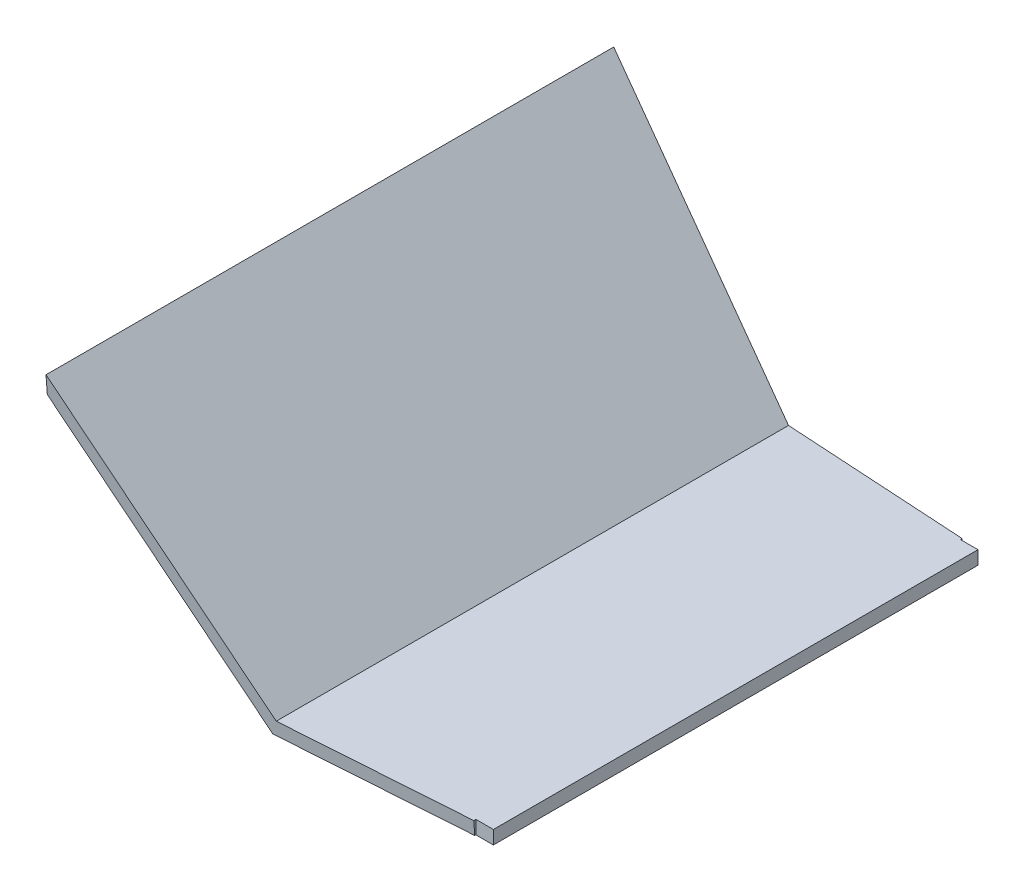
ISO-10303-21;
HEADER;
FILE_DESCRIPTION(('STEP AP214'),'2;1');
FILE_NAME('part.step','',(''),(''),'','','');
FILE_SCHEMA(('AUTOMOTIVE_DESIGN { 1 0 10303 214 1 1 1 1 }'));
ENDSEC;
DATA;
#1=APPLICATION_CONTEXT('core data for automotive mechanical design processes');
#2=APPLICATION_PROTOCOL_DEFINITION('international standard','automotive_design',2000,#1);
#3=PRODUCT_CONTEXT('',#1,'mechanical');
#4=PRODUCT('Part','Part','',(#3));
#5=PRODUCT_RELATED_PRODUCT_CATEGORY('part','',(#4));
#6=PRODUCT_DEFINITION_FORMATION('','',#4);
#7=PRODUCT_DEFINITION_CONTEXT('part definition',#1,'design');
#8=PRODUCT_DEFINITION('design','',#6,#7);
#9=PRODUCT_DEFINITION_SHAPE('','',#8);
#10=(LENGTH_UNIT() NAMED_UNIT(*) SI_UNIT(.MILLI.,.METRE.));
#11=(NAMED_UNIT(*) PLANE_ANGLE_UNIT() SI_UNIT($,.RADIAN.));
#12=(NAMED_UNIT(*) SI_UNIT($,.STERADIAN.) SOLID_ANGLE_UNIT());
#13=UNCERTAINTY_MEASURE_WITH_UNIT(LENGTH_MEASURE(1.E-05),#10,'distance_accuracy_value','');
#14=(GEOMETRIC_REPRESENTATION_CONTEXT(3) GLOBAL_UNCERTAINTY_ASSIGNED_CONTEXT((#13)) GLOBAL_UNIT_ASSIGNED_CONTEXT((#10,
#11,#12)) REPRESENTATION_CONTEXT('',''));
#15=CARTESIAN_POINT('',(0.,0.,0.));
#16=DIRECTION('',(0.,0.,1.));
#17=DIRECTION('',(1.,0.,0.));
#18=AXIS2_PLACEMENT_3D('',#15,#16,#17);
#19=CARTESIAN_POINT('',(10.0673449542567,325.798041942089,5.08));
#20=DIRECTION('',(0.0685256068119308,-0.0732675231063851,0.994955331293276));
#21=DIRECTION('',(0.,-0.997299625833669,-0.0734401546296346));
#22=AXIS2_PLACEMENT_3D('',#19,#20,#21);
#23=PLANE('',#22);
#24=DIRECTION('',(-0.99763665616323,0.,0.0687102778298093));
#25=VECTOR('',#24,1.);
#26=CARTESIAN_POINT('',(25.7885299098299,155.702260243805,-8.52845047903955));
#27=LINE('',#26,#25);
#28=CARTESIAN_POINT('',(10.3273263315878,155.702260243805,-7.46359025474718));
#29=VERTEX_POINT('',#28);
#30=CARTESIAN_POINT('',(-44.3489790529692,155.702260243805,-3.69786642085299));
#31=VERTEX_POINT('',#30);
#32=EDGE_CURVE('E164',#29,#31,#27,.T.);
#33=ORIENTED_EDGE('',*,*,#32,.F.);
#34=DIRECTION('',(0.,0.997299625833669,0.0734401546296346));
#35=VECTOR('',#34,1.);
#36=CARTESIAN_POINT('',(10.3273263315878,325.799353389214,5.06219086364831));
#37=LINE('',#36,#35);
#38=CARTESIAN_POINT('',(10.3273263315878,159.601331401217,-7.17646652453124));
#39=VERTEX_POINT('',#38);
#40=EDGE_CURVE('E53',#29,#39,#37,.T.);
#41=ORIENTED_EDGE('',*,*,#40,.T.);
#42=DIRECTION('',(0.99763665616323,0.,-0.0687102778298093));
#43=VECTOR('',#42,1.);
#44=CARTESIAN_POINT('',(-32.4831494281154,159.601331401217,-4.22797855017373));
#45=LINE('',#44,#43);
#46=CARTESIAN_POINT('',(-43.1605396181928,159.601331401217,-3.4925941374969));
#47=VERTEX_POINT('',#46);
#48=EDGE_CURVE('E148',#47,#39,#45,.T.);
#49=ORIENTED_EDGE('',*,*,#48,.F.);
#50=DIRECTION('',(0.679631594857946,-0.726661548824318,-0.100318935057585));
#51=VECTOR('',#50,1.);
#52=CARTESIAN_POINT('',(-90.0328191655817,209.717134595963,3.42612065371042));
#53=LINE('',#52,#51);
#54=CARTESIAN_POINT('',(-101.23737050154,221.697031777422,5.07999999999999));
#55=VERTEX_POINT('',#54);
#56=EDGE_CURVE('E153',#55,#47,#53,.T.);
#57=ORIENTED_EDGE('',*,*,#56,.F.);
#58=DIRECTION('',(0.,0.997299625833669,0.0734401546296346));
#59=VECTOR('',#58,1.);
#60=CARTESIAN_POINT('',(-101.23737050154,1.19571325539705,-11.1574982490935));
#61=LINE('',#60,#59);
#62=CARTESIAN_POINT('',(-101.23737050154,216.543480298302,4.70049758396129));
#63=VERTEX_POINT('',#62);
#64=EDGE_CURVE('E186',#63,#55,#61,.T.);
#65=ORIENTED_EDGE('',*,*,#64,.F.);
#66=DIRECTION('',(-0.679535061131302,0.726751822934066,0.100318934181391));
#67=VECTOR('',#66,1.);
#68=CARTESIAN_POINT('',(-33.7444084902328,144.360842517586,-5.26340626883956));
#69=LINE('',#68,#67);
#70=EDGE_CURVE('E189',#31,#63,#69,.T.);
#71=ORIENTED_EDGE('',*,*,#70,.F.);
#72=EDGE_LOOP('',(#33,#41,#49,#57,#65,#71));
#73=FACE_BOUND('',#72,.T.);
#74=ADVANCED_FACE('F45',(#73),#23,.T.);
#75=CARTESIAN_POINT('',(-101.23737050154,0.,5.08));
#76=DIRECTION('',(-1.,0.,0.));
#77=DIRECTION('',(0.,-1.,0.));
#78=AXIS2_PLACEMENT_3D('',#75,#76,#77);
#79=PLANE('',#78);
#80=DIRECTION('',(0.,0.,1.));
#81=VECTOR('',#80,1.);
#82=CARTESIAN_POINT('',(-101.23737050154,216.543480298302,-159.258));
#83=LINE('',#82,#81);
#84=CARTESIAN_POINT('',(-101.23737050154,216.543480298302,-158.926777016426));
#85=VERTEX_POINT('',#84);
#86=EDGE_CURVE('E161',#85,#63,#83,.T.);
#87=ORIENTED_EDGE('',*,*,#86,.T.);
#88=ORIENTED_EDGE('',*,*,#64,.T.);
#89=DIRECTION('',(0.,0.,1.));
#90=VECTOR('',#89,1.);
#91=CARTESIAN_POINT('',(-101.23737050154,221.697031777422,-159.258));
#92=LINE('',#91,#90);
#93=CARTESIAN_POINT('',(-101.23737050154,221.697031777422,-159.258));
#94=VERTEX_POINT('',#93);
#95=EDGE_CURVE('E179',#94,#55,#92,.T.);
#96=ORIENTED_EDGE('',*,*,#95,.F.);
#97=DIRECTION('',(0.,-0.997941007475508,0.0641384876557668));
#98=VECTOR('',#97,1.);
#99=CARTESIAN_POINT('',(-101.23737050154,-9.60668300980865,-144.391920397616));
#100=LINE('',#99,#98);
#101=EDGE_CURVE('E195',#94,#85,#100,.T.);
#102=ORIENTED_EDGE('',*,*,#101,.T.);
#103=EDGE_LOOP('',(#87,#88,#96,#102));
#104=FACE_BOUND('',#103,.T.);
#105=ADVANCED_FACE('F47',(#104),#79,.T.);
#106=CARTESIAN_POINT('',(-44.3489790529692,155.702260243805,-159.258));
#107=DIRECTION('',(-0.730436633697796,-0.682980471281743,0.));
#108=DIRECTION('',(0.682980471281743,-0.730436633697796,0.));
#109=AXIS2_PLACEMENT_3D('',#106,#107,#108);
#110=PLANE('',#109);
#111=DIRECTION('',(0.,0.,1.));
#112=VECTOR('',#111,1.);
#113=CARTESIAN_POINT('',(-44.3489790529692,155.702260243805,-159.258));
#114=LINE('',#113,#112);
#115=CARTESIAN_POINT('',(-44.3489790529692,155.702260243805,-151.596833740039));
#116=VERTEX_POINT('',#115);
#117=EDGE_CURVE('E157',#116,#31,#114,.T.);
#118=ORIENTED_EDGE('',*,*,#117,.T.);
#119=ORIENTED_EDGE('',*,*,#70,.T.);
#120=ORIENTED_EDGE('',*,*,#86,.F.);
#121=DIRECTION('',(0.680351200722359,-0.727624671105553,0.0876617457856003));
#122=VECTOR('',#121,1.);
#123=CARTESIAN_POINT('',(-44.8058969384762,156.190926576445,-151.655706597884));
#124=LINE('',#123,#122);
#125=EDGE_CURVE('E198',#85,#116,#124,.T.);
#126=ORIENTED_EDGE('',*,*,#125,.T.);
#127=EDGE_LOOP('',(#118,#119,#120,#126));
#128=FACE_BOUND('',#127,.T.);
#129=ADVANCED_FACE('F217',(#128),#110,.T.);
#130=CARTESIAN_POINT('',(-101.23737050154,221.697031777422,-159.258));
#131=DIRECTION('',(0.730345901940924,0.683077494518813,0.));
#132=DIRECTION('',(-0.683077494518813,0.730345901940924,0.));
#133=AXIS2_PLACEMENT_3D('',#130,#131,#132);
#134=PLANE('',#133);
#135=ORIENTED_EDGE('',*,*,#95,.T.);
#136=ORIENTED_EDGE('',*,*,#56,.T.);
#137=DIRECTION('',(0.,0.,1.));
#138=VECTOR('',#137,1.);
#139=CARTESIAN_POINT('',(-43.1605396181928,159.601331401217,-159.258));
#140=LINE('',#139,#138);
#141=CARTESIAN_POINT('',(-43.1605396181928,159.601331401217,-151.775991751332));
#142=VERTEX_POINT('',#141);
#143=EDGE_CURVE('E150',#142,#47,#140,.T.);
#144=ORIENTED_EDGE('',*,*,#143,.F.);
#145=DIRECTION('',(-0.680447850402848,0.727534288589483,-0.0876617465530859));
#146=VECTOR('',#145,1.);
#147=CARTESIAN_POINT('',(-101.23737050154,221.697031777422,-159.258));
#148=LINE('',#147,#146);
#149=EDGE_CURVE('E193',#142,#94,#148,.T.);
#150=ORIENTED_EDGE('',*,*,#149,.T.);
#151=EDGE_LOOP('',(#135,#136,#144,#150));
#152=FACE_BOUND('',#151,.T.);
#153=ADVANCED_FACE('F222',(#152),#134,.T.);
#154=CARTESIAN_POINT('',(-43.1605396181928,159.601331401217,-159.258));
#155=DIRECTION('',(0.,1.,0.));
#156=DIRECTION('',(0.,0.,1.));
#157=AXIS2_PLACEMENT_3D('',#154,#155,#156);
#158=PLANE('',#157);
#159=DIRECTION('',(-1.,0.,0.));
#160=VECTOR('',#159,1.);
#161=CARTESIAN_POINT('',(-43.1605396181928,159.601331401217,-7.77894523363187));
#162=LINE('',#161,#160);
#163=CARTESIAN_POINT('',(15.4073263315878,159.601331401217,-7.77894523363187));
#164=VERTEX_POINT('',#163);
#165=CARTESIAN_POINT('',(10.3273263315878,159.601331401217,-7.77894523363187));
#166=VERTEX_POINT('',#165);
#167=EDGE_CURVE('E132',#164,#166,#162,.T.);
#168=ORIENTED_EDGE('',*,*,#167,.F.);
#169=DIRECTION('',(0.,0.,1.));
#170=VECTOR('',#169,1.);
#171=CARTESIAN_POINT('',(15.4073263315878,159.601331401217,-159.258));
#172=LINE('',#171,#170);
#173=CARTESIAN_POINT('',(15.4073263315878,159.601331401217,-148.057515550619));
#174=VERTEX_POINT('',#173);
#175=EDGE_CURVE('E142',#174,#164,#172,.T.);
#176=ORIENTED_EDGE('',*,*,#175,.F.);
#177=DIRECTION('',(1.,0.,0.));
#178=VECTOR('',#177,1.);
#179=CARTESIAN_POINT('',(-43.1605396181928,159.601331401217,-148.057515550619));
#180=LINE('',#179,#178);
#181=CARTESIAN_POINT('',(10.3273263315878,159.601331401217,-148.057515550619));
#182=VERTEX_POINT('',#181);
#183=EDGE_CURVE('E133',#182,#174,#180,.T.);
#184=ORIENTED_EDGE('',*,*,#183,.F.);
#185=DIRECTION('',(0.,0.,1.));
#186=VECTOR('',#185,1.);
#187=CARTESIAN_POINT('',(10.3273263315878,159.601331401217,-159.258));
#188=LINE('',#187,#186);
#189=CARTESIAN_POINT('',(10.3273263315878,159.601331401217,-148.560773213659));
#190=VERTEX_POINT('',#189);
#191=EDGE_CURVE('E204',#190,#182,#188,.T.);
#192=ORIENTED_EDGE('',*,*,#191,.F.);
#193=DIRECTION('',(-0.998198204669511,0.,-0.060002868219478));
#194=VECTOR('',#193,1.);
#195=CARTESIAN_POINT('',(-43.6086726716366,159.601331401217,-151.802929556294));
#196=LINE('',#195,#194);
#197=EDGE_CURVE('E175',#190,#142,#196,.T.);
#198=ORIENTED_EDGE('',*,*,#197,.T.);
#199=ORIENTED_EDGE('',*,*,#143,.T.);
#200=ORIENTED_EDGE('',*,*,#48,.T.);
#201=DIRECTION('',(0.,0.,-1.));
#202=VECTOR('',#201,1.);
#203=CARTESIAN_POINT('',(10.3273263315878,159.601331401217,-159.258));
#204=LINE('',#203,#202);
#205=EDGE_CURVE('E67',#39,#166,#204,.T.);
#206=ORIENTED_EDGE('',*,*,#205,.T.);
#207=EDGE_LOOP('',(#168,#176,#184,#192,#198,#199,#200,#206));
#208=FACE_BOUND('',#207,.T.);
#209=ADVANCED_FACE('F171',(#208),#158,.T.);
#210=CARTESIAN_POINT('',(15.4073263315878,155.702260243805,-159.258));
#211=DIRECTION('',(0.,-1.,0.));
#212=DIRECTION('',(0.,0.,-1.));
#213=AXIS2_PLACEMENT_3D('',#210,#211,#212);
#214=PLANE('',#213);
#215=DIRECTION('',(1.,0.,0.));
#216=VECTOR('',#215,1.);
#217=CARTESIAN_POINT('',(15.4073263315878,155.702260243805,-7.77894523363187));
#218=LINE('',#217,#216);
#219=CARTESIAN_POINT('',(10.3273263315878,155.702260243805,-7.77894523363187));
#220=VERTEX_POINT('',#219);
#221=CARTESIAN_POINT('',(15.4073263315878,155.702260243805,-7.77894523363187));
#222=VERTEX_POINT('',#221);
#223=EDGE_CURVE('E123',#220,#222,#218,.T.);
#224=ORIENTED_EDGE('',*,*,#223,.F.);
#225=DIRECTION('',(0.,0.,1.));
#226=VECTOR('',#225,1.);
#227=CARTESIAN_POINT('',(10.3273263315878,155.702260243805,-159.258));
#228=LINE('',#227,#226);
#229=EDGE_CURVE('E208',#220,#29,#228,.T.);
#230=ORIENTED_EDGE('',*,*,#229,.T.);
#231=ORIENTED_EDGE('',*,*,#32,.T.);
#232=ORIENTED_EDGE('',*,*,#117,.F.);
#233=DIRECTION('',(0.998198204669511,0.,0.060002868219478));
#234=VECTOR('',#233,1.);
#235=CARTESIAN_POINT('',(14.7333193857121,155.702260243805,-148.045327284972));
#236=LINE('',#235,#234);
#237=CARTESIAN_POINT('',(10.3273263315878,155.702260243805,-148.310176710032));
#238=VERTEX_POINT('',#237);
#239=EDGE_CURVE('E160',#116,#238,#236,.T.);
#240=ORIENTED_EDGE('',*,*,#239,.T.);
#241=DIRECTION('',(0.,0.,-1.));
#242=VECTOR('',#241,1.);
#243=CARTESIAN_POINT('',(10.3273263315878,155.702260243805,-159.258));
#244=LINE('',#243,#242);
#245=CARTESIAN_POINT('',(10.3273263315878,155.702260243805,-148.057515550619));
#246=VERTEX_POINT('',#245);
#247=EDGE_CURVE('E59',#246,#238,#244,.T.);
#248=ORIENTED_EDGE('',*,*,#247,.F.);
#249=DIRECTION('',(-1.,0.,0.));
#250=VECTOR('',#249,1.);
#251=CARTESIAN_POINT('',(15.4073263315878,155.702260243805,-148.057515550619));
#252=LINE('',#251,#250);
#253=CARTESIAN_POINT('',(15.4073263315878,155.702260243805,-148.057515550619));
#254=VERTEX_POINT('',#253);
#255=EDGE_CURVE('E147',#254,#246,#252,.T.);
#256=ORIENTED_EDGE('',*,*,#255,.F.);
#257=DIRECTION('',(0.,0.,1.));
#258=VECTOR('',#257,1.);
#259=CARTESIAN_POINT('',(15.4073263315878,155.702260243805,-159.258));
#260=LINE('',#259,#258);
#261=EDGE_CURVE('E140',#254,#222,#260,.T.);
#262=ORIENTED_EDGE('',*,*,#261,.T.);
#263=EDGE_LOOP('',(#224,#230,#231,#232,#240,#248,#256,#262));
#264=FACE_BOUND('',#263,.T.);
#265=ADVANCED_FACE('F146',(#264),#214,.T.);
#266=CARTESIAN_POINT('',(15.4073263315878,159.601331401217,-159.258));
#267=DIRECTION('',(1.,0.,0.));
#268=DIRECTION('',(0.,0.,-1.));
#269=AXIS2_PLACEMENT_3D('',#266,#267,#268);
#270=PLANE('',#269);
#271=DIRECTION('',(0.,1.,0.));
#272=VECTOR('',#271,1.);
#273=CARTESIAN_POINT('',(15.4073263315878,165.376578395387,-7.77894523363187));
#274=LINE('',#273,#272);
#275=EDGE_CURVE('E126',#222,#164,#274,.T.);
#276=ORIENTED_EDGE('',*,*,#275,.F.);
#277=ORIENTED_EDGE('',*,*,#261,.F.);
#278=DIRECTION('',(0.,-1.,0.));
#279=VECTOR('',#278,1.);
#280=CARTESIAN_POINT('',(15.4073263315878,165.376578395387,-148.057515550619));
#281=LINE('',#280,#279);
#282=EDGE_CURVE('E143',#174,#254,#281,.T.);
#283=ORIENTED_EDGE('',*,*,#282,.F.);
#284=ORIENTED_EDGE('',*,*,#175,.T.);
#285=EDGE_LOOP('',(#276,#277,#283,#284));
#286=FACE_BOUND('',#285,.T.);
#287=ADVANCED_FACE('F138',(#286),#270,.T.);
#288=CARTESIAN_POINT('',(10.0673449542567,325.798041942089,-159.258));
#289=DIRECTION('',(0.0598797662006251,-0.0640233973520302,-0.996150298996724));
#290=DIRECTION('',(0.,0.997941007475508,-0.0641384876557668));
#291=AXIS2_PLACEMENT_3D('',#288,#289,#290);
#292=PLANE('',#291);
#293=DIRECTION('',(0.,0.997941007475508,-0.0641384876557668));
#294=VECTOR('',#293,1.);
#295=CARTESIAN_POINT('',(10.3273263315878,325.799042220858,-159.242436502341));
#296=LINE('',#295,#294);
#297=EDGE_CURVE('E11',#238,#190,#296,.T.);
#298=ORIENTED_EDGE('',*,*,#297,.F.);
#299=ORIENTED_EDGE('',*,*,#239,.F.);
#300=ORIENTED_EDGE('',*,*,#125,.F.);
#301=ORIENTED_EDGE('',*,*,#101,.F.);
#302=ORIENTED_EDGE('',*,*,#149,.F.);
#303=ORIENTED_EDGE('',*,*,#197,.F.);
#304=EDGE_LOOP('',(#298,#299,#300,#301,#302,#303));
#305=FACE_BOUND('',#304,.T.);
#306=ADVANCED_FACE('F219',(#305),#292,.T.);
#307=CARTESIAN_POINT('',(10.3273263315878,165.376578395387,-7.77894523363187));
#308=DIRECTION('',(0.,0.,-1.));
#309=DIRECTION('',(0.,1.,0.));
#310=AXIS2_PLACEMENT_3D('',#307,#308,#309);
#311=PLANE('',#310);
#312=ORIENTED_EDGE('',*,*,#167,.T.);
#313=DIRECTION('',(0.,1.,0.));
#314=VECTOR('',#313,1.);
#315=CARTESIAN_POINT('',(10.3273263315878,165.376578395387,-7.77894523363187));
#316=LINE('',#315,#314);
#317=EDGE_CURVE('E128',#220,#166,#316,.T.);
#318=ORIENTED_EDGE('',*,*,#317,.F.);
#319=ORIENTED_EDGE('',*,*,#223,.T.);
#320=ORIENTED_EDGE('',*,*,#275,.T.);
#321=EDGE_LOOP('',(#312,#318,#319,#320));
#322=FACE_BOUND('',#321,.T.);
#323=ADVANCED_FACE('F125',(#322),#311,.F.);
#324=CARTESIAN_POINT('',(10.3273263315878,0.,0.));
#325=DIRECTION('',(1.,0.,0.));
#326=DIRECTION('',(0.,0.,-1.));
#327=AXIS2_PLACEMENT_3D('',#324,#325,#326);
#328=PLANE('',#327);
#329=ORIENTED_EDGE('',*,*,#40,.F.);
#330=ORIENTED_EDGE('',*,*,#229,.F.);
#331=ORIENTED_EDGE('',*,*,#317,.T.);
#332=ORIENTED_EDGE('',*,*,#205,.F.);
#333=EDGE_LOOP('',(#329,#330,#331,#332));
#334=FACE_BOUND('',#333,.T.);
#335=ADVANCED_FACE('F213',(#334),#328,.T.);
#336=CARTESIAN_POINT('',(10.3273263315878,165.376578395387,-148.057515550619));
#337=DIRECTION('',(0.,0.,1.));
#338=DIRECTION('',(1.,0.,0.));
#339=AXIS2_PLACEMENT_3D('',#336,#337,#338);
#340=PLANE('',#339);
#341=ORIENTED_EDGE('',*,*,#183,.T.);
#342=ORIENTED_EDGE('',*,*,#282,.T.);
#343=ORIENTED_EDGE('',*,*,#255,.T.);
#344=DIRECTION('',(0.,-1.,0.));
#345=VECTOR('',#344,1.);
#346=CARTESIAN_POINT('',(10.3273263315878,165.376578395387,-148.057515550619));
#347=LINE('',#346,#345);
#348=EDGE_CURVE('E210',#182,#246,#347,.T.);
#349=ORIENTED_EDGE('',*,*,#348,.F.);
#350=EDGE_LOOP('',(#341,#342,#343,#349));
#351=FACE_BOUND('',#350,.T.);
#352=ADVANCED_FACE('F227',(#351),#340,.F.);
#353=CARTESIAN_POINT('',(10.3273263315878,0.,0.));
#354=DIRECTION('',(-1.,0.,0.));
#355=DIRECTION('',(0.,0.,1.));
#356=AXIS2_PLACEMENT_3D('',#353,#354,#355);
#357=PLANE('',#356);
#358=ORIENTED_EDGE('',*,*,#191,.T.);
#359=ORIENTED_EDGE('',*,*,#348,.T.);
#360=ORIENTED_EDGE('',*,*,#247,.T.);
#361=ORIENTED_EDGE('',*,*,#297,.T.);
#362=EDGE_LOOP('',(#358,#359,#360,#361));
#363=FACE_BOUND('',#362,.T.);
#364=ADVANCED_FACE('F223',(#363),#357,.F.);
#365=CLOSED_SHELL('',(#74,#105,#129,#153,#209,#265,#287,#306,#323,#335,#352,#364));
#366=MANIFOLD_SOLID_BREP('B2',#365);
#367=ADVANCED_BREP_SHAPE_REPRESENTATION('',(#18,#366),#14);
#368=SHAPE_DEFINITION_REPRESENTATION(#9,#367);
ENDSEC;
END-ISO-10303-21;
